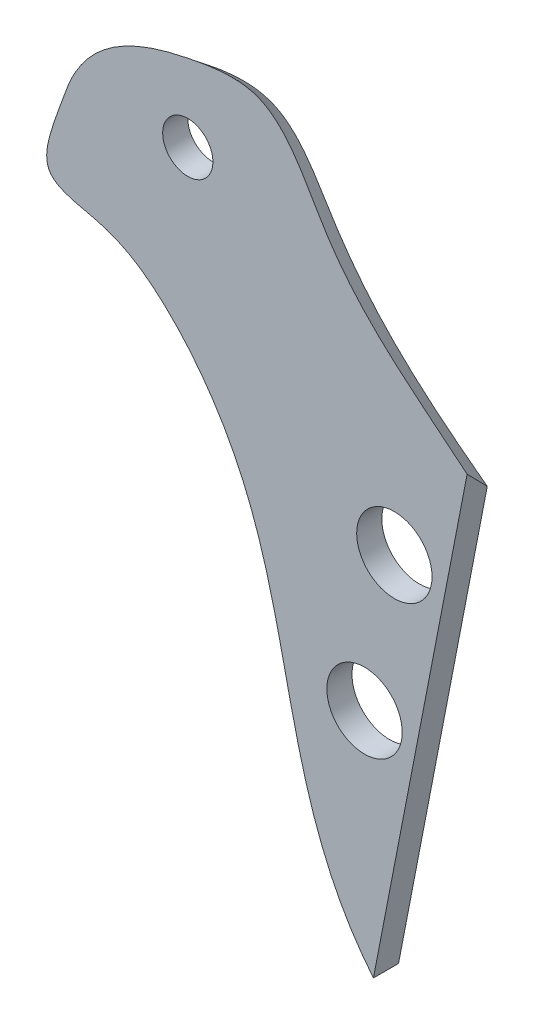
ISO-10303-21;
HEADER;
FILE_DESCRIPTION(('STEP AP214'),'2;1');
FILE_NAME('part.step','',(''),(''),'','','');
FILE_SCHEMA(('AUTOMOTIVE_DESIGN { 1 0 10303 214 1 1 1 1 }'));
ENDSEC;
DATA;
#1=APPLICATION_CONTEXT('core data for automotive mechanical design processes');
#2=APPLICATION_PROTOCOL_DEFINITION('international standard','automotive_design',2000,#1);
#3=PRODUCT_CONTEXT('',#1,'mechanical');
#4=PRODUCT('Part','Part','',(#3));
#5=PRODUCT_RELATED_PRODUCT_CATEGORY('part','',(#4));
#6=PRODUCT_DEFINITION_FORMATION('','',#4);
#7=PRODUCT_DEFINITION_CONTEXT('part definition',#1,'design');
#8=PRODUCT_DEFINITION('design','',#6,#7);
#9=PRODUCT_DEFINITION_SHAPE('','',#8);
#10=(LENGTH_UNIT() NAMED_UNIT(*) SI_UNIT(.MILLI.,.METRE.));
#11=(NAMED_UNIT(*) PLANE_ANGLE_UNIT() SI_UNIT($,.RADIAN.));
#12=(NAMED_UNIT(*) SI_UNIT($,.STERADIAN.) SOLID_ANGLE_UNIT());
#13=UNCERTAINTY_MEASURE_WITH_UNIT(LENGTH_MEASURE(1.E-05),#10,'distance_accuracy_value','');
#14=(GEOMETRIC_REPRESENTATION_CONTEXT(3) GLOBAL_UNCERTAINTY_ASSIGNED_CONTEXT((#13)) GLOBAL_UNIT_ASSIGNED_CONTEXT((#10,
#11,#12)) REPRESENTATION_CONTEXT('',''));
#15=CARTESIAN_POINT('',(0.,0.,0.));
#16=DIRECTION('',(0.,0.,1.));
#17=DIRECTION('',(1.,0.,0.));
#18=AXIS2_PLACEMENT_3D('',#15,#16,#17);
#19=CARTESIAN_POINT('',(0.,0.,30.013289283743));
#20=DIRECTION('',(0.,0.,-1.));
#21=DIRECTION('',(-1.,0.,0.));
#22=AXIS2_PLACEMENT_3D('',#19,#20,#21);
#23=PLANE('',#22);
#24=CARTESIAN_POINT('',(54.2604282887102,-4.8890029578152,30.013289283743));
#25=DIRECTION('',(0.,0.,-1.));
#26=DIRECTION('',(-1.,0.,0.));
#27=AXIS2_PLACEMENT_3D('',#24,#25,#26);
#28=CIRCLE('',#27,2.55);
#29=CARTESIAN_POINT('',(51.7104282887101,-4.8890029578152,30.013289283743));
#30=VERTEX_POINT('',#29);
#31=EDGE_CURVE('E146',#30,#30,#28,.F.);
#32=ORIENTED_EDGE('',*,*,#31,.F.);
#33=EDGE_LOOP('',(#32));
#34=FACE_BOUND('',#33,.T.);
#35=CARTESIAN_POINT('',(59.1866082842384,2.31655029087227,30.013289283743));
#36=CARTESIAN_POINT('',(55.5333547569396,5.37200350174671,30.013289283743));
#37=CARTESIAN_POINT('',(50.3563460795847,8.97370204998886,30.013289283743));
#38=CARTESIAN_POINT('',(46.4228075177713,18.1170294651366,30.013289283743));
#39=CARTESIAN_POINT('',(38.3922126218077,17.1644202277484,30.013289283743));
#40=CARTESIAN_POINT('',(33.8009564372788,15.3919532379688,30.013289283743));
#41=CARTESIAN_POINT('',(32.2359920814305,11.7483802516687,30.013289283743));
#42=B_SPLINE_CURVE_WITH_KNOTS('',3,(#35,#36,#37,#38,#39,#40,#41),.UNSPECIFIED.,.F.,.F.,(4,1,1,1,
4),(0.,0.379573755906784,0.583156846162769,0.702934632684244,1.),.UNSPECIFIED.);
#43=CARTESIAN_POINT('',(59.1866082842384,2.31655029087227,30.013289283743));
#44=VERTEX_POINT('',#43);
#45=CARTESIAN_POINT('',(32.2359920814305,11.7483802516687,30.013289283743));
#46=VERTEX_POINT('',#45);
#47=EDGE_CURVE('E43',#44,#46,#42,.T.);
#48=ORIENTED_EDGE('',*,*,#47,.T.);
#49=CARTESIAN_POINT('',(52.8448032906845,-30.3890029578152,30.013289283743));
#50=CARTESIAN_POINT('',(46.7945352629169,-23.0216187639972,30.013289283743));
#51=CARTESIAN_POINT('',(47.6700154756001,-13.0296286176255,30.013289283743));
#52=CARTESIAN_POINT('',(42.2743675479331,-2.05593228199478,30.013289283743));
#53=CARTESIAN_POINT('',(39.7503754207592,1.30612283839873,30.013289283743));
#54=CARTESIAN_POINT('',(36.5521313909395,3.74916866305139,30.013289283743));
#55=CARTESIAN_POINT('',(34.2723296968009,4.7257787669229,30.013289283743));
#56=CARTESIAN_POINT('',(31.8877538184674,5.05518320589504,30.013289283743));
#57=CARTESIAN_POINT('',(30.8954084548017,5.83965979232856,30.013289283743));
#58=CARTESIAN_POINT('',(30.6076260406025,6.89481594928121,30.013289283743));
#59=CARTESIAN_POINT('',(30.901384361174,7.97609570288549,30.013289283743));
#60=CARTESIAN_POINT('',(31.5575395421801,9.99503953999069,30.013289283743));
#61=CARTESIAN_POINT('',(32.0441402021333,11.2117041286637,30.013289283743));
#62=CARTESIAN_POINT('',(32.2359920814305,11.7483802516687,30.013289283743));
#63=B_SPLINE_CURVE_WITH_KNOTS('',3,(#49,#50,#51,#52,#53,#54,#55,#56,#57,#58,#59,#60,#61,#62),
.UNSPECIFIED.,.F.,.F.,(4,1,1,1,1,1,1,1,1,1,1,4),(0.,0.526438718946362,0.55784527570137,
0.716586823299022,0.767347344514794,0.806434658888385,0.859009912902335,0.881574698264146,
0.895122566085728,0.936526016302592,0.938130825682822,1.),.UNSPECIFIED.);
#64=CARTESIAN_POINT('',(52.8448032906845,-30.3890029578152,30.013289283743));
#65=VERTEX_POINT('',#64);
#66=EDGE_CURVE('E11',#46,#65,#63,.F.);
#67=ORIENTED_EDGE('',*,*,#66,.T.);
#68=DIRECTION('',(-0.190360349727866,-0.98171428493808,0.));
#69=VECTOR('',#68,1.);
#70=CARTESIAN_POINT('',(57.4834926467632,-6.46664932291833,30.013289283743));
#71=LINE('',#70,#69);
#72=EDGE_CURVE('E62',#44,#65,#71,.T.);
#73=ORIENTED_EDGE('',*,*,#72,.F.);
#74=EDGE_LOOP('',(#48,#67,#73));
#75=FACE_BOUND('',#74,.T.);
#76=CARTESIAN_POINT('',(52.2416782887102,-15.017432758745,30.013289283743));
#77=DIRECTION('',(0.,0.,-1.));
#78=DIRECTION('',(-1.,0.,0.));
#79=AXIS2_PLACEMENT_3D('',#76,#77,#78);
#80=CIRCLE('',#79,2.54999999999999);
#81=CARTESIAN_POINT('',(49.6916782887102,-15.017432758745,30.013289283743));
#82=VERTEX_POINT('',#81);
#83=EDGE_CURVE('E143',#82,#82,#80,.F.);
#84=ORIENTED_EDGE('',*,*,#83,.F.);
#85=EDGE_LOOP('',(#84));
#86=FACE_BOUND('',#85,.T.);
#87=CARTESIAN_POINT('',(40.2778882950094,12.0174412329978,30.013289283743));
#88=DIRECTION('',(0.,0.,-1.));
#89=DIRECTION('',(-1.,0.,0.));
#90=AXIS2_PLACEMENT_3D('',#87,#88,#89);
#91=CIRCLE('',#90,1.7);
#92=CARTESIAN_POINT('',(38.5778882950094,12.0174412329978,30.013289283743));
#93=VERTEX_POINT('',#92);
#94=EDGE_CURVE('E300',#93,#93,#91,.F.);
#95=ORIENTED_EDGE('',*,*,#94,.F.);
#96=EDGE_LOOP('',(#95));
#97=FACE_BOUND('',#96,.T.);
#98=ADVANCED_FACE('F39',(#34,#75,#86,#97),#23,.F.);
#99=CARTESIAN_POINT('',(57.4834926467632,-6.46664932291833,17.730789283743));
#100=DIRECTION('',(-0.981714284938079,0.190360349727866,0.));
#101=DIRECTION('',(-0.190360349727866,-0.98171428493808,0.));
#102=AXIS2_PLACEMENT_3D('',#99,#100,#101);
#103=PLANE('',#102);
#104=DIRECTION('',(0.137169592660813,0.707402296574711,0.693373271514046));
#105=VECTOR('',#104,1.);
#106=CARTESIAN_POINT('',(59.0184533256443,1.44935223638781,29.163289283743));
#107=LINE('',#106,#105);
#108=CARTESIAN_POINT('',(58.8502983670502,0.582154181903358,28.313289283743));
#109=VERTEX_POINT('',#108);
#110=EDGE_CURVE('E142',#109,#44,#107,.T.);
#111=ORIENTED_EDGE('',*,*,#110,.T.);
#112=ORIENTED_EDGE('',*,*,#72,.T.);
#113=DIRECTION('',(0.,0.,-1.));
#114=VECTOR('',#113,1.);
#115=CARTESIAN_POINT('',(52.8448032906845,-30.3890029578152,29.163289283743));
#116=LINE('',#115,#114);
#117=CARTESIAN_POINT('',(52.8448032906845,-30.3890029578152,28.313289283743));
#118=VERTEX_POINT('',#117);
#119=EDGE_CURVE('E89',#65,#118,#116,.T.);
#120=ORIENTED_EDGE('',*,*,#119,.T.);
#121=DIRECTION('',(0.190360349727867,0.981714284938079,0.));
#122=VECTOR('',#121,1.);
#123=CARTESIAN_POINT('',(58.8502983670502,0.582154181903358,28.313289283743));
#124=LINE('',#123,#122);
#125=EDGE_CURVE('E77',#118,#109,#124,.T.);
#126=ORIENTED_EDGE('',*,*,#125,.T.);
#127=EDGE_LOOP('',(#111,#112,#120,#126));
#128=FACE_BOUND('',#127,.T.);
#129=ADVANCED_FACE('F90',(#128),#103,.F.);
#130=CARTESIAN_POINT('',(40.2778882950094,12.0174412329978,32.138289283743));
#131=DIRECTION('',(0.,0.,-1.));
#132=DIRECTION('',(-1.,0.,0.));
#133=AXIS2_PLACEMENT_3D('',#130,#131,#132);
#134=CYLINDRICAL_SURFACE('',#133,1.7);
#135=ORIENTED_EDGE('',*,*,#94,.T.);
#136=EDGE_LOOP('',(#135));
#137=FACE_BOUND('',#136,.T.);
#138=CARTESIAN_POINT('',(40.2778882950094,12.0174412329978,28.313289283743));
#139=DIRECTION('',(0.,0.,-1.));
#140=DIRECTION('',(-1.,0.,0.));
#141=AXIS2_PLACEMENT_3D('',#138,#139,#140);
#142=CIRCLE('',#141,1.7);
#143=CARTESIAN_POINT('',(38.5778882950094,12.0174412329978,28.313289283743));
#144=VERTEX_POINT('',#143);
#145=EDGE_CURVE('E231',#144,#144,#142,.T.);
#146=ORIENTED_EDGE('',*,*,#145,.T.);
#147=EDGE_LOOP('',(#146));
#148=FACE_BOUND('',#147,.T.);
#149=ADVANCED_FACE('F196',(#137,#148),#134,.F.);
#150=CARTESIAN_POINT('',(54.2604282887102,-4.8890029578152,12.6008001156402));
#151=DIRECTION('',(0.,0.,1.));
#152=DIRECTION('',(1.,0.,0.));
#153=AXIS2_PLACEMENT_3D('',#150,#151,#152);
#154=CYLINDRICAL_SURFACE('',#153,2.55);
#155=ORIENTED_EDGE('',*,*,#31,.T.);
#156=EDGE_LOOP('',(#155));
#157=FACE_BOUND('',#156,.T.);
#158=CARTESIAN_POINT('',(54.2604282887102,-4.8890029578152,28.313289283743));
#159=DIRECTION('',(0.,0.,1.));
#160=DIRECTION('',(1.,0.,0.));
#161=AXIS2_PLACEMENT_3D('',#158,#159,#160);
#162=CIRCLE('',#161,2.55);
#163=CARTESIAN_POINT('',(56.8104282887102,-4.8890029578152,28.313289283743));
#164=VERTEX_POINT('',#163);
#165=EDGE_CURVE('E228',#164,#164,#162,.T.);
#166=ORIENTED_EDGE('',*,*,#165,.F.);
#167=EDGE_LOOP('',(#166));
#168=FACE_BOUND('',#167,.T.);
#169=ADVANCED_FACE('F199',(#157,#168),#154,.F.);
#170=CARTESIAN_POINT('',(52.2416782887102,-15.017432758745,12.6008001156402));
#171=DIRECTION('',(0.,0.,1.));
#172=DIRECTION('',(1.,0.,0.));
#173=AXIS2_PLACEMENT_3D('',#170,#171,#172);
#174=CYLINDRICAL_SURFACE('',#173,2.54999999999999);
#175=ORIENTED_EDGE('',*,*,#83,.T.);
#176=EDGE_LOOP('',(#175));
#177=FACE_BOUND('',#176,.T.);
#178=CARTESIAN_POINT('',(52.2416782887102,-15.017432758745,28.313289283743));
#179=DIRECTION('',(0.,0.,1.));
#180=DIRECTION('',(1.,0.,0.));
#181=AXIS2_PLACEMENT_3D('',#178,#179,#180);
#182=CIRCLE('',#181,2.54999999999999);
#183=CARTESIAN_POINT('',(54.7916782887101,-15.017432758745,28.313289283743));
#184=VERTEX_POINT('',#183);
#185=EDGE_CURVE('E224',#184,#184,#182,.T.);
#186=ORIENTED_EDGE('',*,*,#185,.F.);
#187=EDGE_LOOP('',(#186));
#188=FACE_BOUND('',#187,.T.);
#189=ADVANCED_FACE('F116',(#177,#188),#174,.F.);
#190=CARTESIAN_POINT('',(32.2359920814305,11.7483802516687,30.013289283743));
#191=CARTESIAN_POINT('',(33.9072419780726,11.1608982302468,28.313289283743));
#192=CARTESIAN_POINT('',(32.0441402021333,11.2117041286637,30.013289283743));
#193=CARTESIAN_POINT('',(33.6960790230969,10.8900327996302,28.313289283743));
#194=CARTESIAN_POINT('',(31.5575395421801,9.99503953999069,30.013289283743));
#195=CARTESIAN_POINT('',(33.252586061417,9.5089346619242,28.313289283743));
#196=CARTESIAN_POINT('',(30.901384361174,7.97609570288549,30.013289283743));
#197=CARTESIAN_POINT('',(32.8743340025538,7.41147323989284,28.313289283743));
#198=CARTESIAN_POINT('',(30.6076260406025,6.89481594928121,30.013289283743));
#199=CARTESIAN_POINT('',(32.8187157287241,6.36576028868581,28.313289283743));
#200=CARTESIAN_POINT('',(30.8954084548017,5.83965979232856,30.013289283743));
#201=CARTESIAN_POINT('',(33.8524947128075,5.89269391999161,28.313289283743));
#202=CARTESIAN_POINT('',(31.8877538184674,5.05518320589504,30.013289283743));
#203=CARTESIAN_POINT('',(35.4904654784108,5.71324151605375,28.313289283743));
#204=CARTESIAN_POINT('',(34.2723296968009,4.7257787669229,30.013289283743));
#205=CARTESIAN_POINT('',(37.126538770345,4.84407443991782,28.313289283743));
#206=CARTESIAN_POINT('',(36.5521313909395,3.74916866305139,30.013289283743));
#207=CARTESIAN_POINT('',(38.8133976572541,3.28302426988339,28.313289283743));
#208=CARTESIAN_POINT('',(39.7503754207592,1.30612283839873,30.013289283743));
#209=CARTESIAN_POINT('',(41.6207904889491,0.368883155269356,28.313289283743));
#210=CARTESIAN_POINT('',(42.2743675479331,-2.05593228199478,30.013289283743));
#211=CARTESIAN_POINT('',(43.8960701658193,-2.86406152662291,28.313289283743));
#212=CARTESIAN_POINT('',(47.6700154756001,-13.0296286176255,30.013289283743));
#213=CARTESIAN_POINT('',(48.3131551141228,-13.4219038997801,28.313289283743));
#214=CARTESIAN_POINT('',(46.7945352629169,-23.0216187639972,30.013289283743));
#215=CARTESIAN_POINT('',(47.1184838147925,-23.5036868540762,28.313289283743));
#216=CARTESIAN_POINT('',(52.8448032906845,-30.3890029578152,30.013289283743));
#217=CARTESIAN_POINT('',(52.8448032906845,-30.3890029578152,28.313289283743));
#218=B_SPLINE_SURFACE_WITH_KNOTS('',3,1,((#190,#191),(#192,#193),(#194,#195),(#196,#197),(#198,
#199),(#200,#201),(#202,#203),(#204,#205),(#206,#207),(#208,#209),(#210,#211),(#212,#213),(#214,
#215),(#216,#217)),.UNSPECIFIED.,.F.,.F.,.F.,(4,1,1,1,1,1,1,1,1,1,1,4),(2,2),(0.,
0.0618691743171781,0.0634739836974081,0.104877433914272,0.118425301735854,0.140990087097665,
0.193565341111615,0.232652655485206,0.283413176700978,0.44215472429863,0.473561281053638,1.),
(0.,1.),.UNSPECIFIED.);
#219=DIRECTION('',(0.680686533146075,-0.239276664280315,-0.692396217150602));
#220=VECTOR('',#219,1.);
#221=CARTESIAN_POINT('',(33.0716170297516,11.4546392409578,29.163289283743));
#222=LINE('',#221,#220);
#223=CARTESIAN_POINT('',(33.9072419780726,11.1608982302468,28.313289283743));
#224=VERTEX_POINT('',#223);
#225=EDGE_CURVE('E91',#46,#224,#222,.T.);
#226=CARTESIAN_POINT('',(33.9072419780726,11.1608982302468,28.313289283743));
#227=CARTESIAN_POINT('',(33.6960790230969,10.8900327996302,28.313289283743));
#228=CARTESIAN_POINT('',(32.9632999997767,8.60805804038253,28.313289283743));
#229=CARTESIAN_POINT('',(32.7656863797307,5.95017231439694,28.313289283743));
#230=CARTESIAN_POINT('',(36.0475396281196,5.77660384822842,28.313289283743));
#231=CARTESIAN_POINT('',(40.1509390488213,2.23022416718721,28.313289283743));
#232=CARTESIAN_POINT('',(49.0161937001583,-8.99625873655049,28.313289283743));
#233=CARTESIAN_POINT('',(46.7768600490162,-23.0929190605882,28.313289283743));
#234=CARTESIAN_POINT('',(52.8448032906845,-30.3890029578152,28.313289283743));
#235=B_SPLINE_CURVE_WITH_KNOTS('',3,(#226,#227,#228,#229,#230,#231,#232,#233,#234),
.UNSPECIFIED.,.F.,.F.,(4,1,1,1,1,1,4),(0.,0.0618691743171781,0.104877433914272,
0.140990087097665,0.232652655485206,0.44215472429863,1.),.UNSPECIFIED.);
#236=EDGE_CURVE('E81',#224,#118,#235,.T.);
#237=ORIENTED_EDGE('',*,*,#66,.F.);
#238=ORIENTED_EDGE('',*,*,#225,.T.);
#239=ORIENTED_EDGE('',*,*,#236,.T.);
#240=ORIENTED_EDGE('',*,*,#119,.F.);
#241=EDGE_LOOP('',(#237,#238,#239,#240));
#242=FACE_BOUND('',#241,.T.);
#243=ADVANCED_FACE('F94',(#242),#218,.F.);
#244=CARTESIAN_POINT('',(45.6690504757318,-7.32977099782672,28.313289283743));
#245=DIRECTION('',(0.,0.,1.));
#246=DIRECTION('',(-1.,0.,0.));
#247=AXIS2_PLACEMENT_3D('',#244,#245,#246);
#248=PLANE('',#247);
#249=ORIENTED_EDGE('',*,*,#185,.T.);
#250=EDGE_LOOP('',(#249));
#251=FACE_BOUND('',#250,.T.);
#252=ORIENTED_EDGE('',*,*,#165,.T.);
#253=EDGE_LOOP('',(#252));
#254=FACE_BOUND('',#253,.T.);
#255=ORIENTED_EDGE('',*,*,#145,.F.);
#256=EDGE_LOOP('',(#255));
#257=FACE_BOUND('',#256,.T.);
#258=ORIENTED_EDGE('',*,*,#236,.F.);
#259=CARTESIAN_POINT('',(58.8502983670502,0.582154181903358,28.313289283743));
#260=CARTESIAN_POINT('',(54.6375536116588,3.72911890341942,28.313289283743));
#261=CARTESIAN_POINT('',(49.7861220121252,7.82016955184531,28.313289283743));
#262=CARTESIAN_POINT('',(45.5580551972648,16.2243115229969,28.313289283743));
#263=CARTESIAN_POINT('',(38.8669179019402,16.1253118462174,28.313289283743));
#264=CARTESIAN_POINT('',(35.0563370192907,14.0514408900861,28.313289283743));
#265=CARTESIAN_POINT('',(33.9072419780726,11.1608982302468,28.313289283743));
#266=B_SPLINE_CURVE_WITH_KNOTS('',3,(#259,#260,#261,#262,#263,#264,#265),.UNSPECIFIED.,.F.,.F.,
(4,1,1,1,4),(0.,0.443669854560584,0.631844867473527,0.739701273066536,1.),.UNSPECIFIED.);
#267=EDGE_CURVE('E83',#109,#224,#266,.T.);
#268=ORIENTED_EDGE('',*,*,#267,.F.);
#269=ORIENTED_EDGE('',*,*,#125,.F.);
#270=EDGE_LOOP('',(#258,#268,#269));
#271=FACE_BOUND('',#270,.T.);
#272=ADVANCED_FACE('F79',(#251,#254,#257,#271),#248,.F.);
#273=CARTESIAN_POINT('',(59.1866082842384,2.31655029087227,30.013289283743));
#274=CARTESIAN_POINT('',(58.8502983670502,0.582154181903358,28.313289283743));
#275=CARTESIAN_POINT('',(55.5333547569396,5.37200350174671,30.013289283743));
#276=CARTESIAN_POINT('',(55.2461604409695,3.2744831890996,28.313289283743));
#277=CARTESIAN_POINT('',(51.5946499264045,8.11220124028726,30.013289283743));
#278=CARTESIAN_POINT('',(51.7231101959465,6.18677194480138,28.313289283743));
#279=CARTESIAN_POINT('',(47.8736223660526,14.744677836155,30.013289283743));
#280=CARTESIAN_POINT('',(47.9329539294505,11.6745344007484,28.313289283743));
#281=CARTESIAN_POINT('',(46.0945183802308,17.2988517696202,30.013289283743));
#282=CARTESIAN_POINT('',(46.4528492452718,14.4457265233554,28.313289283743));
#283=CARTESIAN_POINT('',(43.1574925504654,17.729689642728,30.013289283743));
#284=CARTESIAN_POINT('',(44.1998997690521,15.9816749883543,28.313289283743));
#285=CARTESIAN_POINT('',(41.1665096117991,17.4396555021939,30.013289283743));
#286=CARTESIAN_POINT('',(42.4398056461874,16.1781750167425,28.313289283743));
#287=CARTESIAN_POINT('',(36.6679775910553,16.498774584857,30.013289283743));
#288=CARTESIAN_POINT('',(38.1311049895818,15.7248529463592,28.313289283743));
#289=CARTESIAN_POINT('',(33.6072668052544,14.9410021934079,30.013289283743));
#290=CARTESIAN_POINT('',(35.0563370192907,14.0514408900861,28.313289283743));
#291=CARTESIAN_POINT('',(32.2359920814305,11.7483802516687,30.013289283743));
#292=CARTESIAN_POINT('',(33.9072419780726,11.1608982302468,28.313289283743));
#293=B_SPLINE_SURFACE_WITH_KNOTS('',3,1,((#273,#274),(#275,#276),(#277,#278),(#279,#280),(#281,
#282),(#283,#284),(#285,#286),(#287,#288),(#289,#290),(#291,#292)),.UNSPECIFIED.,.F.,.F.,.F.,(4,
1,1,1,1,1,1,4),(2,2),(0.,0.379573755906784,0.443669854560584,0.583156846162769,
0.631844867473527,0.702934632684244,0.739701273066536,1.),(0.,1.),.UNSPECIFIED.);
#294=ORIENTED_EDGE('',*,*,#47,.F.);
#295=ORIENTED_EDGE('',*,*,#110,.F.);
#296=ORIENTED_EDGE('',*,*,#267,.T.);
#297=ORIENTED_EDGE('',*,*,#225,.F.);
#298=EDGE_LOOP('',(#294,#295,#296,#297));
#299=FACE_BOUND('',#298,.T.);
#300=ADVANCED_FACE('F117',(#299),#293,.F.);
#301=CLOSED_SHELL('',(#98,#129,#149,#169,#189,#243,#272,#300));
#302=MANIFOLD_SOLID_BREP('B2',#301);
#303=ADVANCED_BREP_SHAPE_REPRESENTATION('',(#18,#302),#14);
#304=SHAPE_DEFINITION_REPRESENTATION(#9,#303);
ENDSEC;
END-ISO-10303-21;
